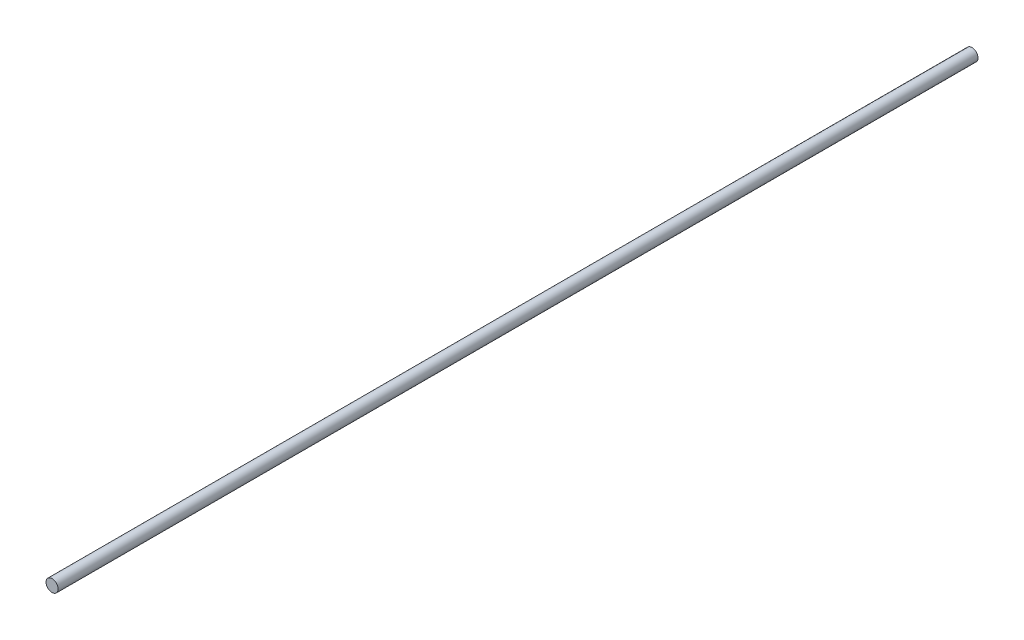
ISO-10303-21;
HEADER;
FILE_DESCRIPTION(('STEP AP214'),'2;1');
FILE_NAME('part.step','',(''),(''),'','','');
FILE_SCHEMA(('AUTOMOTIVE_DESIGN { 1 0 10303 214 1 1 1 1 }'));
ENDSEC;
DATA;
#1=APPLICATION_CONTEXT('core data for automotive mechanical design processes');
#2=APPLICATION_PROTOCOL_DEFINITION('international standard','automotive_design',2000,#1);
#3=PRODUCT_CONTEXT('',#1,'mechanical');
#4=PRODUCT('Part','Part','',(#3));
#5=PRODUCT_RELATED_PRODUCT_CATEGORY('part','',(#4));
#6=PRODUCT_DEFINITION_FORMATION('','',#4);
#7=PRODUCT_DEFINITION_CONTEXT('part definition',#1,'design');
#8=PRODUCT_DEFINITION('design','',#6,#7);
#9=PRODUCT_DEFINITION_SHAPE('','',#8);
#10=(LENGTH_UNIT() NAMED_UNIT(*) SI_UNIT(.MILLI.,.METRE.));
#11=(NAMED_UNIT(*) PLANE_ANGLE_UNIT() SI_UNIT($,.RADIAN.));
#12=(NAMED_UNIT(*) SI_UNIT($,.STERADIAN.) SOLID_ANGLE_UNIT());
#13=UNCERTAINTY_MEASURE_WITH_UNIT(LENGTH_MEASURE(1.E-05),#10,'distance_accuracy_value','');
#14=(GEOMETRIC_REPRESENTATION_CONTEXT(3) GLOBAL_UNCERTAINTY_ASSIGNED_CONTEXT((#13)) GLOBAL_UNIT_ASSIGNED_CONTEXT((#10,
#11,#12)) REPRESENTATION_CONTEXT('',''));
#15=CARTESIAN_POINT('',(0.,0.,0.));
#16=DIRECTION('',(0.,0.,1.));
#17=DIRECTION('',(1.,0.,0.));
#18=AXIS2_PLACEMENT_3D('',#15,#16,#17);
#19=CARTESIAN_POINT('',(0.,0.,114.));
#20=DIRECTION('',(0.,0.,-1.));
#21=DIRECTION('',(-1.,0.,0.));
#22=AXIS2_PLACEMENT_3D('',#19,#20,#21);
#23=CYLINDRICAL_SURFACE('',#22,0.75);
#24=CARTESIAN_POINT('',(0.,0.,114.));
#25=DIRECTION('',(0.,0.,1.));
#26=DIRECTION('',(1.,0.,0.));
#27=AXIS2_PLACEMENT_3D('',#24,#25,#26);
#28=CIRCLE('',#27,0.75);
#29=CARTESIAN_POINT('',(-0.75,0.,114.));
#30=VERTEX_POINT('',#29);
#31=EDGE_CURVE('E10',#30,#30,#28,.T.);
#32=CARTESIAN_POINT('',(0.,0.,0.));
#33=DIRECTION('',(0.,0.,1.));
#34=DIRECTION('',(1.,0.,0.));
#35=AXIS2_PLACEMENT_3D('',#32,#33,#34);
#36=CIRCLE('',#35,0.75);
#37=CARTESIAN_POINT('',(-0.75,0.,0.));
#38=VERTEX_POINT('',#37);
#39=EDGE_CURVE('E40',#38,#38,#36,.T.);
#40=CARTESIAN_POINT('',(-0.75,0.,114.));
#41=CARTESIAN_POINT('',(-0.75,0.,112.8125));
#42=CARTESIAN_POINT('',(-0.75,0.,111.625));
#43=CARTESIAN_POINT('',(-0.75,0.,109.25));
#44=CARTESIAN_POINT('',(-0.75,0.,108.0625));
#45=CARTESIAN_POINT('',(-0.75,0.,105.6875));
#46=CARTESIAN_POINT('',(-0.75,0.,104.5));
#47=CARTESIAN_POINT('',(-0.75,0.,102.125));
#48=CARTESIAN_POINT('',(-0.75,0.,100.9375));
#49=CARTESIAN_POINT('',(-0.75,0.,98.5625));
#50=CARTESIAN_POINT('',(-0.75,0.,97.375));
#51=CARTESIAN_POINT('',(-0.75,0.,95.));
#52=CARTESIAN_POINT('',(-0.75,0.,93.8125));
#53=CARTESIAN_POINT('',(-0.75,0.,91.4375));
#54=CARTESIAN_POINT('',(-0.75,0.,90.25));
#55=CARTESIAN_POINT('',(-0.75,0.,87.875));
#56=CARTESIAN_POINT('',(-0.75,0.,86.6875));
#57=CARTESIAN_POINT('',(-0.75,0.,84.3125));
#58=CARTESIAN_POINT('',(-0.75,0.,83.125));
#59=CARTESIAN_POINT('',(-0.75,0.,80.75));
#60=CARTESIAN_POINT('',(-0.75,0.,79.5625));
#61=CARTESIAN_POINT('',(-0.75,0.,77.1875));
#62=CARTESIAN_POINT('',(-0.75,0.,76.));
#63=CARTESIAN_POINT('',(-0.75,0.,73.625));
#64=CARTESIAN_POINT('',(-0.75,0.,72.4375));
#65=CARTESIAN_POINT('',(-0.75,0.,70.0625));
#66=CARTESIAN_POINT('',(-0.75,0.,68.875));
#67=CARTESIAN_POINT('',(-0.75,0.,66.5));
#68=CARTESIAN_POINT('',(-0.75,0.,65.3125));
#69=CARTESIAN_POINT('',(-0.75,0.,62.9375));
#70=CARTESIAN_POINT('',(-0.75,0.,61.75));
#71=CARTESIAN_POINT('',(-0.75,0.,59.375));
#72=CARTESIAN_POINT('',(-0.75,0.,58.1875));
#73=CARTESIAN_POINT('',(-0.75,0.,55.8125));
#74=CARTESIAN_POINT('',(-0.75,0.,54.625));
#75=CARTESIAN_POINT('',(-0.75,0.,52.25));
#76=CARTESIAN_POINT('',(-0.75,0.,51.0625));
#77=CARTESIAN_POINT('',(-0.75,0.,48.6875));
#78=CARTESIAN_POINT('',(-0.75,0.,47.5));
#79=CARTESIAN_POINT('',(-0.75,0.,45.125));
#80=CARTESIAN_POINT('',(-0.75,0.,43.9375));
#81=CARTESIAN_POINT('',(-0.75,0.,41.5625));
#82=CARTESIAN_POINT('',(-0.75,0.,40.375));
#83=CARTESIAN_POINT('',(-0.75,0.,38.));
#84=CARTESIAN_POINT('',(-0.75,0.,36.8125));
#85=CARTESIAN_POINT('',(-0.75,0.,34.4375));
#86=CARTESIAN_POINT('',(-0.75,0.,33.25));
#87=CARTESIAN_POINT('',(-0.75,0.,30.875));
#88=CARTESIAN_POINT('',(-0.75,0.,29.6875));
#89=CARTESIAN_POINT('',(-0.75,0.,27.3125));
#90=CARTESIAN_POINT('',(-0.75,0.,26.125));
#91=CARTESIAN_POINT('',(-0.75,0.,23.75));
#92=CARTESIAN_POINT('',(-0.75,0.,22.5625));
#93=CARTESIAN_POINT('',(-0.75,0.,20.1875));
#94=CARTESIAN_POINT('',(-0.75,0.,19.));
#95=CARTESIAN_POINT('',(-0.75,0.,16.625));
#96=CARTESIAN_POINT('',(-0.75,0.,15.4375));
#97=CARTESIAN_POINT('',(-0.75,0.,13.0625));
#98=CARTESIAN_POINT('',(-0.75,0.,11.875));
#99=CARTESIAN_POINT('',(-0.75,0.,9.5));
#100=CARTESIAN_POINT('',(-0.75,0.,8.31250000000001));
#101=CARTESIAN_POINT('',(-0.75,0.,5.9375));
#102=CARTESIAN_POINT('',(-0.75,0.,4.75));
#103=CARTESIAN_POINT('',(-0.75,0.,2.375));
#104=CARTESIAN_POINT('',(-0.75,0.,1.1875));
#105=CARTESIAN_POINT('',(-0.75,0.,0.));
#106=B_SPLINE_CURVE_WITH_KNOTS('',3,(#40,#41,#42,#43,#44,#45,#46,#47,#48,#49,#50,#51,#52,#53,
#54,#55,#56,#57,#58,#59,#60,#61,#62,#63,#64,#65,#66,#67,#68,#69,#70,#71,#72,#73,#74,#75,#76,#77,
#78,#79,#80,#81,#82,#83,#84,#85,#86,#87,#88,#89,#90,#91,#92,#93,#94,#95,#96,#97,#98,#99,#100,
#101,#102,#103,#104,#105),.UNSPECIFIED.,.F.,.F.,(4,2,2,2,2,2,2,2,2,2,2,2,2,2,2,2,2,2,2,2,2,2,2,
2,2,2,2,2,2,2,2,2,4),(0.,3.5625,7.12499999999999,10.6875,14.25,17.8125,21.375,24.9375,28.5,
32.0625,35.625,39.1875,42.75,46.3125,49.875,53.4375,57.,60.5625,64.125,67.6875,71.25,74.8125,
78.375,81.9375,85.5,89.0625,92.625,96.1875,99.75,103.3125,106.875,110.4375,114.),.UNSPECIFIED.);
#107=EDGE_CURVE('BSEAM37',#30,#38,#106,.T.);
#108=ORIENTED_EDGE('',*,*,#31,.F.);
#109=ORIENTED_EDGE('',*,*,#39,.T.);
#110=ORIENTED_EDGE('',*,*,#107,.T.);
#111=ORIENTED_EDGE('',*,*,#107,.F.);
#112=EDGE_LOOP('',(#108,#110,#109,#111));
#113=FACE_BOUND('',#112,.T.);
#114=ADVANCED_FACE('F37',(#113),#23,.T.);
#115=CARTESIAN_POINT('',(0.,0.,114.));
#116=DIRECTION('',(0.,0.,1.));
#117=DIRECTION('',(1.,0.,0.));
#118=AXIS2_PLACEMENT_3D('',#115,#116,#117);
#119=PLANE('',#118);
#120=ORIENTED_EDGE('',*,*,#31,.T.);
#121=EDGE_LOOP('',(#120));
#122=FACE_BOUND('',#121,.T.);
#123=ADVANCED_FACE('F52',(#122),#119,.T.);
#124=CARTESIAN_POINT('',(0.,0.,0.));
#125=DIRECTION('',(0.,0.,1.));
#126=DIRECTION('',(1.,0.,0.));
#127=AXIS2_PLACEMENT_3D('',#124,#125,#126);
#128=PLANE('',#127);
#129=ORIENTED_EDGE('',*,*,#39,.F.);
#130=EDGE_LOOP('',(#129));
#131=FACE_BOUND('',#130,.T.);
#132=ADVANCED_FACE('F50',(#131),#128,.F.);
#133=CLOSED_SHELL('',(#114,#123,#132));
#134=MANIFOLD_SOLID_BREP('B2',#133);
#135=ADVANCED_BREP_SHAPE_REPRESENTATION('',(#18,#134),#14);
#136=SHAPE_DEFINITION_REPRESENTATION(#9,#135);
ENDSEC;
END-ISO-10303-21;
